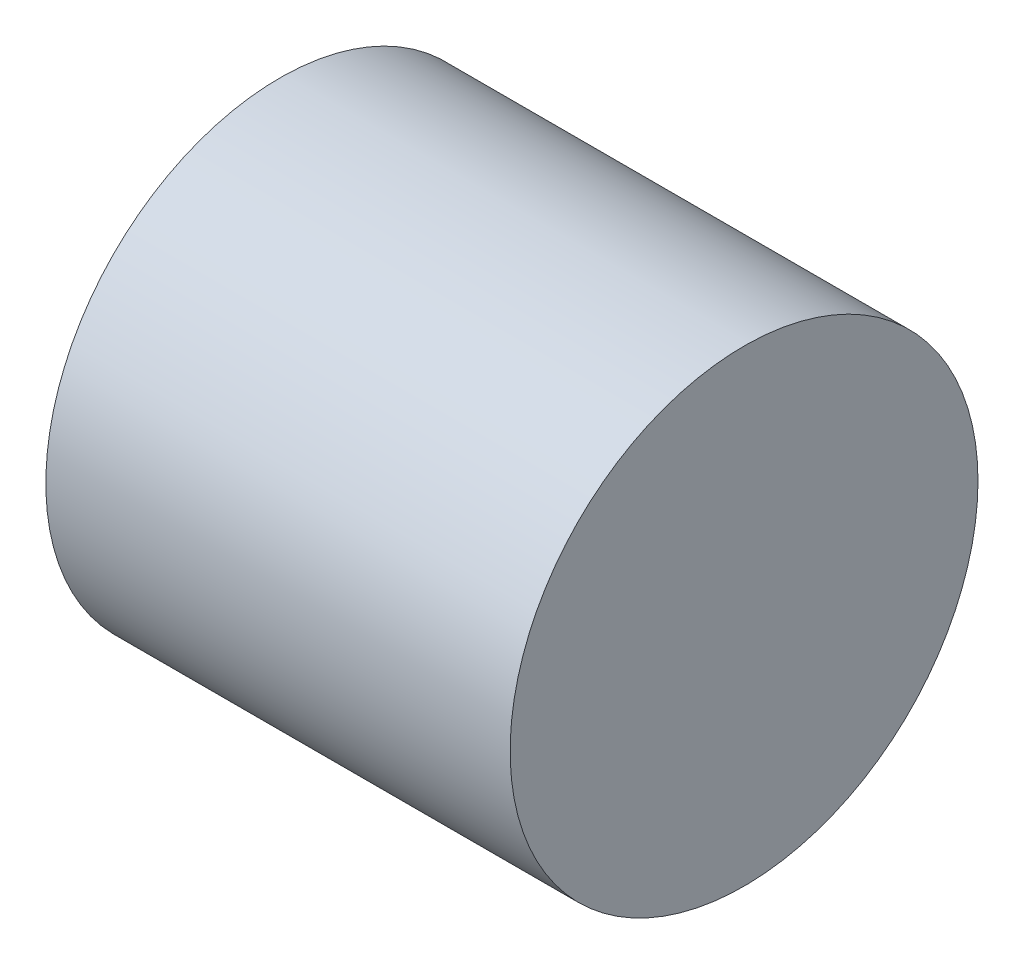
ISO-10303-21;
HEADER;
FILE_DESCRIPTION(('STEP AP214'),'2;1');
FILE_NAME('part.step','',(''),(''),'','','');
FILE_SCHEMA(('AUTOMOTIVE_DESIGN { 1 0 10303 214 1 1 1 1 }'));
ENDSEC;
DATA;
#1=APPLICATION_CONTEXT('core data for automotive mechanical design processes');
#2=APPLICATION_PROTOCOL_DEFINITION('international standard','automotive_design',2000,#1);
#3=PRODUCT_CONTEXT('',#1,'mechanical');
#4=PRODUCT('Part','Part','',(#3));
#5=PRODUCT_RELATED_PRODUCT_CATEGORY('part','',(#4));
#6=PRODUCT_DEFINITION_FORMATION('','',#4);
#7=PRODUCT_DEFINITION_CONTEXT('part definition',#1,'design');
#8=PRODUCT_DEFINITION('design','',#6,#7);
#9=PRODUCT_DEFINITION_SHAPE('','',#8);
#10=(LENGTH_UNIT() NAMED_UNIT(*) SI_UNIT(.MILLI.,.METRE.));
#11=(NAMED_UNIT(*) PLANE_ANGLE_UNIT() SI_UNIT($,.RADIAN.));
#12=(NAMED_UNIT(*) SI_UNIT($,.STERADIAN.) SOLID_ANGLE_UNIT());
#13=UNCERTAINTY_MEASURE_WITH_UNIT(LENGTH_MEASURE(1.E-05),#10,'distance_accuracy_value','');
#14=(GEOMETRIC_REPRESENTATION_CONTEXT(3) GLOBAL_UNCERTAINTY_ASSIGNED_CONTEXT((#13)) GLOBAL_UNIT_ASSIGNED_CONTEXT((#10,
#11,#12)) REPRESENTATION_CONTEXT('',''));
#15=CARTESIAN_POINT('',(0.,0.,0.));
#16=DIRECTION('',(0.,0.,1.));
#17=DIRECTION('',(1.,0.,0.));
#18=AXIS2_PLACEMENT_3D('',#15,#16,#17);
#19=CARTESIAN_POINT('',(10.16,45.8221014837827,7.97795516905145));
#20=DIRECTION('',(-1.,0.,0.));
#21=DIRECTION('',(0.,0.,1.));
#22=AXIS2_PLACEMENT_3D('',#19,#20,#21);
#23=CYLINDRICAL_SURFACE('',#22,5.11907181179017);
#24=CARTESIAN_POINT('',(10.16,45.8221014837827,7.97795516905145));
#25=DIRECTION('',(1.,0.,0.));
#26=DIRECTION('',(0.,0.,-1.));
#27=AXIS2_PLACEMENT_3D('',#24,#25,#26);
#28=CIRCLE('',#27,5.11907181179017);
#29=CARTESIAN_POINT('',(10.16,45.8221014837827,2.85888335726128));
#30=VERTEX_POINT('',#29);
#31=EDGE_CURVE('E10',#30,#30,#28,.T.);
#32=ORIENTED_EDGE('',*,*,#31,.F.);
#33=EDGE_LOOP('',(#32));
#34=FACE_BOUND('',#33,.T.);
#35=CARTESIAN_POINT('',(0.,45.8221014837827,7.97795516905145));
#36=DIRECTION('',(1.,0.,0.));
#37=DIRECTION('',(0.,0.,-1.));
#38=AXIS2_PLACEMENT_3D('',#35,#36,#37);
#39=CIRCLE('',#38,5.11907181179017);
#40=CARTESIAN_POINT('',(0.,45.8221014837827,2.85888335726128));
#41=VERTEX_POINT('',#40);
#42=EDGE_CURVE('E33',#41,#41,#39,.T.);
#43=ORIENTED_EDGE('',*,*,#42,.T.);
#44=EDGE_LOOP('',(#43));
#45=FACE_BOUND('',#44,.T.);
#46=ADVANCED_FACE('F30',(#34,#45),#23,.T.);
#47=CARTESIAN_POINT('',(10.16,45.8221014837827,7.97795516905145));
#48=DIRECTION('',(1.,0.,0.));
#49=DIRECTION('',(0.,0.,-1.));
#50=AXIS2_PLACEMENT_3D('',#47,#48,#49);
#51=PLANE('',#50);
#52=ORIENTED_EDGE('',*,*,#31,.T.);
#53=EDGE_LOOP('',(#52));
#54=FACE_BOUND('',#53,.T.);
#55=ADVANCED_FACE('F45',(#54),#51,.T.);
#56=CARTESIAN_POINT('',(0.,45.8221014837827,7.97795516905145));
#57=DIRECTION('',(1.,0.,0.));
#58=DIRECTION('',(0.,0.,-1.));
#59=AXIS2_PLACEMENT_3D('',#56,#57,#58);
#60=PLANE('',#59);
#61=ORIENTED_EDGE('',*,*,#42,.F.);
#62=EDGE_LOOP('',(#61));
#63=FACE_BOUND('',#62,.T.);
#64=ADVANCED_FACE('F43',(#63),#60,.F.);
#65=CLOSED_SHELL('',(#46,#55,#64));
#66=MANIFOLD_SOLID_BREP('B2',#65);
#67=ADVANCED_BREP_SHAPE_REPRESENTATION('',(#18,#66),#14);
#68=SHAPE_DEFINITION_REPRESENTATION(#9,#67);
ENDSEC;
END-ISO-10303-21;
